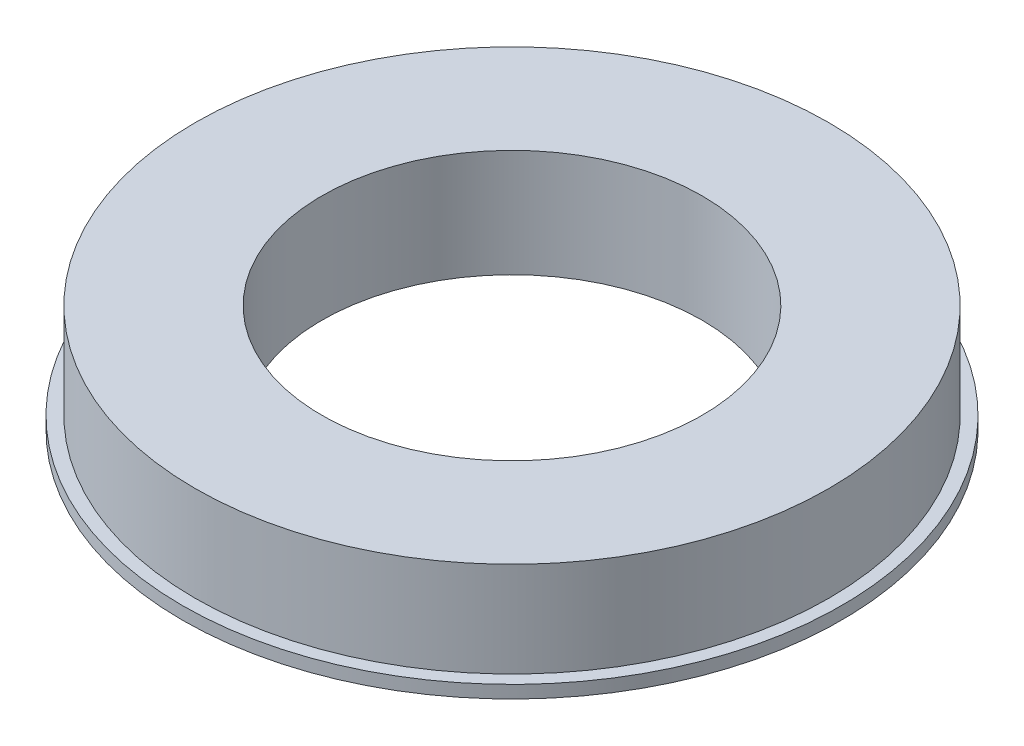
ISO-10303-21;
HEADER;
FILE_DESCRIPTION(('STEP AP214'),'2;1');
FILE_NAME('part.step','',(''),(''),'','','');
FILE_SCHEMA(('AUTOMOTIVE_DESIGN { 1 0 10303 214 1 1 1 1 }'));
ENDSEC;
DATA;
#1=APPLICATION_CONTEXT('core data for automotive mechanical design processes');
#2=APPLICATION_PROTOCOL_DEFINITION('international standard','automotive_design',2000,#1);
#3=PRODUCT_CONTEXT('',#1,'mechanical');
#4=PRODUCT('Part','Part','',(#3));
#5=PRODUCT_RELATED_PRODUCT_CATEGORY('part','',(#4));
#6=PRODUCT_DEFINITION_FORMATION('','',#4);
#7=PRODUCT_DEFINITION_CONTEXT('part definition',#1,'design');
#8=PRODUCT_DEFINITION('design','',#6,#7);
#9=PRODUCT_DEFINITION_SHAPE('','',#8);
#10=(LENGTH_UNIT() NAMED_UNIT(*) SI_UNIT(.MILLI.,.METRE.));
#11=(NAMED_UNIT(*) PLANE_ANGLE_UNIT() SI_UNIT($,.RADIAN.));
#12=(NAMED_UNIT(*) SI_UNIT($,.STERADIAN.) SOLID_ANGLE_UNIT());
#13=UNCERTAINTY_MEASURE_WITH_UNIT(LENGTH_MEASURE(1.E-05),#10,'distance_accuracy_value','');
#14=(GEOMETRIC_REPRESENTATION_CONTEXT(3) GLOBAL_UNCERTAINTY_ASSIGNED_CONTEXT((#13)) GLOBAL_UNIT_ASSIGNED_CONTEXT((#10,
#11,#12)) REPRESENTATION_CONTEXT('',''));
#15=CARTESIAN_POINT('',(0.,0.,0.));
#16=DIRECTION('',(0.,0.,1.));
#17=DIRECTION('',(1.,0.,0.));
#18=AXIS2_PLACEMENT_3D('',#15,#16,#17);
#19=CARTESIAN_POINT('',(0.,2.54,0.));
#20=DIRECTION('',(0.,-1.,0.));
#21=DIRECTION('',(0.,0.,-1.));
#22=AXIS2_PLACEMENT_3D('',#19,#20,#21);
#23=CYLINDRICAL_SURFACE('',#22,66.04);
#24=CARTESIAN_POINT('',(0.,2.54,0.));
#25=DIRECTION('',(0.,1.,0.));
#26=DIRECTION('',(0.,0.,1.));
#27=AXIS2_PLACEMENT_3D('',#24,#25,#26);
#28=CIRCLE('',#27,66.04);
#29=CARTESIAN_POINT('',(0.,2.54,66.04));
#30=VERTEX_POINT('',#29);
#31=EDGE_CURVE('E10',#30,#30,#28,.T.);
#32=ORIENTED_EDGE('',*,*,#31,.F.);
#33=EDGE_LOOP('',(#32));
#34=FACE_BOUND('',#33,.T.);
#35=CARTESIAN_POINT('',(0.,0.,0.));
#36=DIRECTION('',(0.,1.,0.));
#37=DIRECTION('',(0.,0.,1.));
#38=AXIS2_PLACEMENT_3D('',#35,#36,#37);
#39=CIRCLE('',#38,66.04);
#40=CARTESIAN_POINT('',(0.,0.,66.04));
#41=VERTEX_POINT('',#40);
#42=EDGE_CURVE('E45',#41,#41,#39,.T.);
#43=ORIENTED_EDGE('',*,*,#42,.T.);
#44=EDGE_LOOP('',(#43));
#45=FACE_BOUND('',#44,.T.);
#46=ADVANCED_FACE('F37',(#34,#45),#23,.T.);
#47=CARTESIAN_POINT('',(0.,2.54,0.));
#48=DIRECTION('',(0.,1.,0.));
#49=DIRECTION('',(0.,0.,1.));
#50=AXIS2_PLACEMENT_3D('',#47,#48,#49);
#51=PLANE('',#50);
#52=CARTESIAN_POINT('',(0.,2.54,0.));
#53=DIRECTION('',(0.,1.,0.));
#54=DIRECTION('',(0.,0.,1.));
#55=AXIS2_PLACEMENT_3D('',#52,#53,#54);
#56=CIRCLE('',#55,63.5);
#57=CARTESIAN_POINT('',(0.,2.54,-63.5));
#58=VERTEX_POINT('',#57);
#59=EDGE_CURVE('E53',#58,#58,#56,.T.);
#60=ORIENTED_EDGE('',*,*,#59,.F.);
#61=EDGE_LOOP('',(#60));
#62=FACE_BOUND('',#61,.T.);
#63=ORIENTED_EDGE('',*,*,#31,.T.);
#64=EDGE_LOOP('',(#63));
#65=FACE_BOUND('',#64,.T.);
#66=ADVANCED_FACE('F84',(#62,#65),#51,.T.);
#67=CARTESIAN_POINT('',(0.,0.,0.));
#68=DIRECTION('',(0.,1.,0.));
#69=DIRECTION('',(0.,0.,1.));
#70=AXIS2_PLACEMENT_3D('',#67,#68,#69);
#71=PLANE('',#70);
#72=CARTESIAN_POINT('',(0.,0.,0.));
#73=DIRECTION('',(0.,1.,0.));
#74=DIRECTION('',(0.,0.,1.));
#75=AXIS2_PLACEMENT_3D('',#72,#73,#74);
#76=CIRCLE('',#75,38.1);
#77=CARTESIAN_POINT('',(0.,0.,-38.1));
#78=VERTEX_POINT('',#77);
#79=EDGE_CURVE('E40',#78,#78,#76,.T.);
#80=ORIENTED_EDGE('',*,*,#79,.T.);
#81=EDGE_LOOP('',(#80));
#82=FACE_BOUND('',#81,.T.);
#83=ORIENTED_EDGE('',*,*,#42,.F.);
#84=EDGE_LOOP('',(#83));
#85=FACE_BOUND('',#84,.T.);
#86=ADVANCED_FACE('F69',(#82,#85),#71,.F.);
#87=CARTESIAN_POINT('',(0.,21.59,0.));
#88=DIRECTION('',(0.,1.,0.));
#89=DIRECTION('',(0.,0.,1.));
#90=AXIS2_PLACEMENT_3D('',#87,#88,#89);
#91=PLANE('',#90);
#92=CARTESIAN_POINT('',(0.,21.59,0.));
#93=DIRECTION('',(0.,1.,0.));
#94=DIRECTION('',(0.,0.,1.));
#95=AXIS2_PLACEMENT_3D('',#92,#93,#94);
#96=CIRCLE('',#95,63.5);
#97=CARTESIAN_POINT('',(0.,21.59,-63.5));
#98=VERTEX_POINT('',#97);
#99=EDGE_CURVE('E51',#98,#98,#96,.T.);
#100=ORIENTED_EDGE('',*,*,#99,.T.);
#101=EDGE_LOOP('',(#100));
#102=FACE_BOUND('',#101,.T.);
#103=CARTESIAN_POINT('',(0.,21.59,0.));
#104=DIRECTION('',(0.,1.,0.));
#105=DIRECTION('',(0.,0.,1.));
#106=AXIS2_PLACEMENT_3D('',#103,#104,#105);
#107=CIRCLE('',#106,38.1);
#108=CARTESIAN_POINT('',(0.,21.59,-38.1));
#109=VERTEX_POINT('',#108);
#110=EDGE_CURVE('E57',#109,#109,#107,.T.);
#111=ORIENTED_EDGE('',*,*,#110,.F.);
#112=EDGE_LOOP('',(#111));
#113=FACE_BOUND('',#112,.T.);
#114=ADVANCED_FACE('F79',(#102,#113),#91,.T.);
#115=CARTESIAN_POINT('',(0.,21.59,0.));
#116=DIRECTION('',(0.,-1.,0.));
#117=DIRECTION('',(0.,0.,-1.));
#118=AXIS2_PLACEMENT_3D('',#115,#116,#117);
#119=CYLINDRICAL_SURFACE('',#118,63.5);
#120=CARTESIAN_POINT('',(0.,21.59,-63.5));
#121=CARTESIAN_POINT('',(0.,21.3915625,-63.5));
#122=CARTESIAN_POINT('',(0.,21.193125,-63.5));
#123=CARTESIAN_POINT('',(0.,20.79625,-63.5));
#124=CARTESIAN_POINT('',(0.,20.5978125,-63.5));
#125=CARTESIAN_POINT('',(0.,20.2009375,-63.5));
#126=CARTESIAN_POINT('',(0.,20.0025,-63.5));
#127=CARTESIAN_POINT('',(0.,19.605625,-63.5));
#128=CARTESIAN_POINT('',(0.,19.4071875,-63.5));
#129=CARTESIAN_POINT('',(0.,19.0103125,-63.5));
#130=CARTESIAN_POINT('',(0.,18.811875,-63.5));
#131=CARTESIAN_POINT('',(0.,18.415,-63.5));
#132=CARTESIAN_POINT('',(0.,18.2165625,-63.5));
#133=CARTESIAN_POINT('',(0.,17.8196875,-63.5));
#134=CARTESIAN_POINT('',(0.,17.62125,-63.5));
#135=CARTESIAN_POINT('',(0.,17.224375,-63.5));
#136=CARTESIAN_POINT('',(0.,17.0259375,-63.5));
#137=CARTESIAN_POINT('',(0.,16.6290625,-63.5));
#138=CARTESIAN_POINT('',(0.,16.430625,-63.5));
#139=CARTESIAN_POINT('',(0.,16.03375,-63.5));
#140=CARTESIAN_POINT('',(0.,15.8353125,-63.5));
#141=CARTESIAN_POINT('',(0.,15.4384375,-63.5));
#142=CARTESIAN_POINT('',(0.,15.24,-63.5));
#143=CARTESIAN_POINT('',(0.,14.843125,-63.5));
#144=CARTESIAN_POINT('',(0.,14.6446875,-63.5));
#145=CARTESIAN_POINT('',(0.,14.2478125,-63.5));
#146=CARTESIAN_POINT('',(0.,14.049375,-63.5));
#147=CARTESIAN_POINT('',(0.,13.6525,-63.5));
#148=CARTESIAN_POINT('',(0.,13.4540625,-63.5));
#149=CARTESIAN_POINT('',(0.,13.0571875,-63.5));
#150=CARTESIAN_POINT('',(0.,12.85875,-63.5));
#151=CARTESIAN_POINT('',(0.,12.461875,-63.5));
#152=CARTESIAN_POINT('',(0.,12.2634375,-63.5));
#153=CARTESIAN_POINT('',(0.,11.8665625,-63.5));
#154=CARTESIAN_POINT('',(0.,11.668125,-63.5));
#155=CARTESIAN_POINT('',(0.,11.27125,-63.5));
#156=CARTESIAN_POINT('',(0.,11.0728125,-63.5));
#157=CARTESIAN_POINT('',(0.,10.6759375,-63.5));
#158=CARTESIAN_POINT('',(0.,10.4775,-63.5));
#159=CARTESIAN_POINT('',(0.,10.080625,-63.5));
#160=CARTESIAN_POINT('',(0.,9.8821875,-63.5));
#161=CARTESIAN_POINT('',(0.,9.4853125,-63.5));
#162=CARTESIAN_POINT('',(0.,9.286875,-63.5));
#163=CARTESIAN_POINT('',(0.,8.89,-63.5));
#164=CARTESIAN_POINT('',(0.,8.6915625,-63.5));
#165=CARTESIAN_POINT('',(0.,8.2946875,-63.5));
#166=CARTESIAN_POINT('',(0.,8.09625,-63.5));
#167=CARTESIAN_POINT('',(0.,7.699375,-63.5));
#168=CARTESIAN_POINT('',(0.,7.5009375,-63.5));
#169=CARTESIAN_POINT('',(0.,7.1040625,-63.5));
#170=CARTESIAN_POINT('',(0.,6.905625,-63.5));
#171=CARTESIAN_POINT('',(0.,6.50875,-63.5));
#172=CARTESIAN_POINT('',(0.,6.3103125,-63.5));
#173=CARTESIAN_POINT('',(0.,5.9134375,-63.5));
#174=CARTESIAN_POINT('',(0.,5.715,-63.5));
#175=CARTESIAN_POINT('',(0.,5.318125,-63.5));
#176=CARTESIAN_POINT('',(0.,5.1196875,-63.5));
#177=CARTESIAN_POINT('',(0.,4.7228125,-63.5));
#178=CARTESIAN_POINT('',(0.,4.524375,-63.5));
#179=CARTESIAN_POINT('',(0.,4.1275,-63.5));
#180=CARTESIAN_POINT('',(0.,3.9290625,-63.5));
#181=CARTESIAN_POINT('',(0.,3.5321875,-63.5));
#182=CARTESIAN_POINT('',(0.,3.33375,-63.5));
#183=CARTESIAN_POINT('',(0.,2.936875,-63.5));
#184=CARTESIAN_POINT('',(0.,2.7384375,-63.5));
#185=CARTESIAN_POINT('',(0.,2.54,-63.5));
#186=B_SPLINE_CURVE_WITH_KNOTS('',3,(#120,#121,#122,#123,#124,#125,#126,#127,#128,#129,#130,
#131,#132,#133,#134,#135,#136,#137,#138,#139,#140,#141,#142,#143,#144,#145,#146,#147,#148,#149,
#150,#151,#152,#153,#154,#155,#156,#157,#158,#159,#160,#161,#162,#163,#164,#165,#166,#167,#168,
#169,#170,#171,#172,#173,#174,#175,#176,#177,#178,#179,#180,#181,#182,#183,#184,#185),
.UNSPECIFIED.,.F.,.F.,(4,2,2,2,2,2,2,2,2,2,2,2,2,2,2,2,2,2,2,2,2,2,2,2,2,2,2,2,2,2,2,2,4),(0.,
0.5953125,1.190625,1.7859375,2.38125,2.9765625,3.571875,4.1671875,4.7625,5.3578125,5.953125,
6.5484375,7.14375,7.7390625,8.334375,8.9296875,9.525,10.1203125,10.715625,11.3109375,11.90625,
12.5015625,13.096875,13.6921875,14.2875,14.8828125,15.478125,16.0734375,16.66875,17.2640625,
17.859375,18.4546875,19.05),.UNSPECIFIED.);
#187=EDGE_CURVE('BSEAM74',#98,#58,#186,.T.);
#188=ORIENTED_EDGE('',*,*,#99,.F.);
#189=ORIENTED_EDGE('',*,*,#59,.T.);
#190=ORIENTED_EDGE('',*,*,#187,.T.);
#191=ORIENTED_EDGE('',*,*,#187,.F.);
#192=EDGE_LOOP('',(#188,#190,#189,#191));
#193=FACE_BOUND('',#192,.T.);
#194=ADVANCED_FACE('F74',(#193),#119,.T.);
#195=CARTESIAN_POINT('',(0.,21.59,0.));
#196=DIRECTION('',(0.,-1.,0.));
#197=DIRECTION('',(0.,0.,-1.));
#198=AXIS2_PLACEMENT_3D('',#195,#196,#197);
#199=CYLINDRICAL_SURFACE('',#198,38.1);
#200=CARTESIAN_POINT('',(0.,21.59,-38.1));
#201=CARTESIAN_POINT('',(0.,21.3651041666667,-38.1));
#202=CARTESIAN_POINT('',(0.,21.1402083333333,-38.1));
#203=CARTESIAN_POINT('',(0.,20.6904166666667,-38.1));
#204=CARTESIAN_POINT('',(0.,20.4655208333333,-38.1));
#205=CARTESIAN_POINT('',(0.,20.0157291666667,-38.1));
#206=CARTESIAN_POINT('',(0.,19.7908333333333,-38.1));
#207=CARTESIAN_POINT('',(0.,19.3410416666667,-38.1));
#208=CARTESIAN_POINT('',(0.,19.1161458333333,-38.1));
#209=CARTESIAN_POINT('',(0.,18.6663541666667,-38.1));
#210=CARTESIAN_POINT('',(0.,18.4414583333333,-38.1));
#211=CARTESIAN_POINT('',(0.,17.9916666666667,-38.1));
#212=CARTESIAN_POINT('',(0.,17.7667708333333,-38.1));
#213=CARTESIAN_POINT('',(0.,17.3169791666667,-38.1));
#214=CARTESIAN_POINT('',(0.,17.0920833333333,-38.1));
#215=CARTESIAN_POINT('',(0.,16.6422916666667,-38.1));
#216=CARTESIAN_POINT('',(0.,16.4173958333333,-38.1));
#217=CARTESIAN_POINT('',(0.,15.9676041666667,-38.1));
#218=CARTESIAN_POINT('',(0.,15.7427083333333,-38.1));
#219=CARTESIAN_POINT('',(0.,15.2929166666667,-38.1));
#220=CARTESIAN_POINT('',(0.,15.0680208333333,-38.1));
#221=CARTESIAN_POINT('',(0.,14.6182291666667,-38.1));
#222=CARTESIAN_POINT('',(0.,14.3933333333333,-38.1));
#223=CARTESIAN_POINT('',(0.,13.9435416666667,-38.1));
#224=CARTESIAN_POINT('',(0.,13.7186458333333,-38.1));
#225=CARTESIAN_POINT('',(0.,13.2688541666667,-38.1));
#226=CARTESIAN_POINT('',(0.,13.0439583333333,-38.1));
#227=CARTESIAN_POINT('',(0.,12.5941666666667,-38.1));
#228=CARTESIAN_POINT('',(0.,12.3692708333333,-38.1));
#229=CARTESIAN_POINT('',(0.,11.9194791666667,-38.1));
#230=CARTESIAN_POINT('',(0.,11.6945833333333,-38.1));
#231=CARTESIAN_POINT('',(0.,11.2447916666667,-38.1));
#232=CARTESIAN_POINT('',(0.,11.0198958333333,-38.1));
#233=CARTESIAN_POINT('',(0.,10.5701041666667,-38.1));
#234=CARTESIAN_POINT('',(0.,10.3452083333333,-38.1));
#235=CARTESIAN_POINT('',(0.,9.89541666666667,-38.1));
#236=CARTESIAN_POINT('',(0.,9.67052083333333,-38.1));
#237=CARTESIAN_POINT('',(0.,9.22072916666667,-38.1));
#238=CARTESIAN_POINT('',(0.,8.99583333333334,-38.1));
#239=CARTESIAN_POINT('',(0.,8.54604166666667,-38.1));
#240=CARTESIAN_POINT('',(0.,8.32114583333333,-38.1));
#241=CARTESIAN_POINT('',(0.,7.87135416666667,-38.1));
#242=CARTESIAN_POINT('',(0.,7.64645833333333,-38.1));
#243=CARTESIAN_POINT('',(0.,7.19666666666667,-38.1));
#244=CARTESIAN_POINT('',(0.,6.97177083333333,-38.1));
#245=CARTESIAN_POINT('',(0.,6.52197916666667,-38.1));
#246=CARTESIAN_POINT('',(0.,6.29708333333333,-38.1));
#247=CARTESIAN_POINT('',(0.,5.84729166666667,-38.1));
#248=CARTESIAN_POINT('',(0.,5.62239583333333,-38.1));
#249=CARTESIAN_POINT('',(0.,5.17260416666667,-38.1));
#250=CARTESIAN_POINT('',(0.,4.94770833333333,-38.1));
#251=CARTESIAN_POINT('',(0.,4.49791666666667,-38.1));
#252=CARTESIAN_POINT('',(0.,4.27302083333333,-38.1));
#253=CARTESIAN_POINT('',(0.,3.82322916666667,-38.1));
#254=CARTESIAN_POINT('',(0.,3.59833333333333,-38.1));
#255=CARTESIAN_POINT('',(0.,3.14854166666667,-38.1));
#256=CARTESIAN_POINT('',(0.,2.92364583333333,-38.1));
#257=CARTESIAN_POINT('',(0.,2.47385416666667,-38.1));
#258=CARTESIAN_POINT('',(0.,2.24895833333333,-38.1));
#259=CARTESIAN_POINT('',(0.,1.79916666666667,-38.1));
#260=CARTESIAN_POINT('',(0.,1.57427083333333,-38.1));
#261=CARTESIAN_POINT('',(0.,1.12447916666667,-38.1));
#262=CARTESIAN_POINT('',(0.,0.899583333333333,-38.1));
#263=CARTESIAN_POINT('',(0.,0.449791666666667,-38.1));
#264=CARTESIAN_POINT('',(0.,0.224895833333333,-38.1));
#265=CARTESIAN_POINT('',(0.,0.,-38.1));
#266=B_SPLINE_CURVE_WITH_KNOTS('',3,(#200,#201,#202,#203,#204,#205,#206,#207,#208,#209,#210,
#211,#212,#213,#214,#215,#216,#217,#218,#219,#220,#221,#222,#223,#224,#225,#226,#227,#228,#229,
#230,#231,#232,#233,#234,#235,#236,#237,#238,#239,#240,#241,#242,#243,#244,#245,#246,#247,#248,
#249,#250,#251,#252,#253,#254,#255,#256,#257,#258,#259,#260,#261,#262,#263,#264,#265),
.UNSPECIFIED.,.F.,.F.,(4,2,2,2,2,2,2,2,2,2,2,2,2,2,2,2,2,2,2,2,2,2,2,2,2,2,2,2,2,2,2,2,4),(0.,
0.6746875,1.349375,2.0240625,2.69875,3.3734375,4.048125,4.7228125,5.3975,6.0721875,6.746875,
7.4215625,8.09625,8.7709375,9.445625,10.1203125,10.795,11.4696875,12.144375,12.8190625,13.49375,
14.1684375,14.843125,15.5178125,16.1925,16.8671875,17.541875,18.2165625,18.89125,19.5659375,
20.240625,20.9153125,21.59),.UNSPECIFIED.);
#267=EDGE_CURVE('BSEAM72',#109,#78,#266,.T.);
#268=ORIENTED_EDGE('',*,*,#110,.T.);
#269=ORIENTED_EDGE('',*,*,#79,.F.);
#270=ORIENTED_EDGE('',*,*,#267,.T.);
#271=ORIENTED_EDGE('',*,*,#267,.F.);
#272=EDGE_LOOP('',(#268,#270,#269,#271));
#273=FACE_BOUND('',#272,.T.);
#274=ADVANCED_FACE('F72',(#273),#199,.F.);
#275=CLOSED_SHELL('',(#46,#66,#86,#114,#194,#274));
#276=MANIFOLD_SOLID_BREP('B2',#275);
#277=ADVANCED_BREP_SHAPE_REPRESENTATION('',(#18,#276),#14);
#278=SHAPE_DEFINITION_REPRESENTATION(#9,#277);
ENDSEC;
END-ISO-10303-21;
